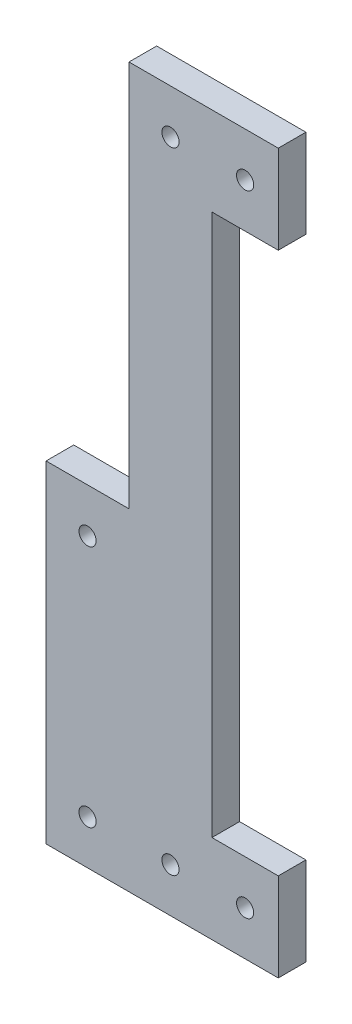
ISO-10303-21;
HEADER;
FILE_DESCRIPTION(('STEP AP214'),'2;1');
FILE_NAME('part.step','',(''),(''),'','','');
FILE_SCHEMA(('AUTOMOTIVE_DESIGN { 1 0 10303 214 1 1 1 1 }'));
ENDSEC;
DATA;
#1=APPLICATION_CONTEXT('core data for automotive mechanical design processes');
#2=APPLICATION_PROTOCOL_DEFINITION('international standard','automotive_design',2000,#1);
#3=PRODUCT_CONTEXT('',#1,'mechanical');
#4=PRODUCT('Part','Part','',(#3));
#5=PRODUCT_RELATED_PRODUCT_CATEGORY('part','',(#4));
#6=PRODUCT_DEFINITION_FORMATION('','',#4);
#7=PRODUCT_DEFINITION_CONTEXT('part definition',#1,'design');
#8=PRODUCT_DEFINITION('design','',#6,#7);
#9=PRODUCT_DEFINITION_SHAPE('','',#8);
#10=(LENGTH_UNIT() NAMED_UNIT(*) SI_UNIT(.MILLI.,.METRE.));
#11=(NAMED_UNIT(*) PLANE_ANGLE_UNIT() SI_UNIT($,.RADIAN.));
#12=(NAMED_UNIT(*) SI_UNIT($,.STERADIAN.) SOLID_ANGLE_UNIT());
#13=UNCERTAINTY_MEASURE_WITH_UNIT(LENGTH_MEASURE(1.E-05),#10,'distance_accuracy_value','');
#14=(GEOMETRIC_REPRESENTATION_CONTEXT(3) GLOBAL_UNCERTAINTY_ASSIGNED_CONTEXT((#13)) GLOBAL_UNIT_ASSIGNED_CONTEXT((#10,
#11,#12)) REPRESENTATION_CONTEXT('',''));
#15=CARTESIAN_POINT('',(0.,0.,0.));
#16=DIRECTION('',(0.,0.,1.));
#17=DIRECTION('',(1.,0.,0.));
#18=AXIS2_PLACEMENT_3D('',#15,#16,#17);
#19=CARTESIAN_POINT('',(0.,0.,5.));
#20=DIRECTION('',(0.,1.,0.));
#21=DIRECTION('',(0.,0.,1.));
#22=AXIS2_PLACEMENT_3D('',#19,#20,#21);
#23=PLANE('',#22);
#24=DIRECTION('',(1.,0.,0.));
#25=VECTOR('',#24,1.);
#26=CARTESIAN_POINT('',(0.,0.,0.));
#27=LINE('',#26,#25);
#28=CARTESIAN_POINT('',(0.,0.,0.));
#29=VERTEX_POINT('',#28);
#30=CARTESIAN_POINT('',(42.,0.,0.));
#31=VERTEX_POINT('',#30);
#32=EDGE_CURVE('E168',#29,#31,#27,.T.);
#33=ORIENTED_EDGE('',*,*,#32,.T.);
#34=DIRECTION('',(0.,0.,-1.));
#35=VECTOR('',#34,1.);
#36=CARTESIAN_POINT('',(42.,0.,5.));
#37=LINE('',#36,#35);
#38=CARTESIAN_POINT('',(42.,0.,5.));
#39=VERTEX_POINT('',#38);
#40=EDGE_CURVE('E11',#39,#31,#37,.T.);
#41=ORIENTED_EDGE('',*,*,#40,.F.);
#42=DIRECTION('',(1.,0.,0.));
#43=VECTOR('',#42,1.);
#44=CARTESIAN_POINT('',(0.,0.,5.));
#45=LINE('',#44,#43);
#46=CARTESIAN_POINT('',(0.,0.,5.));
#47=VERTEX_POINT('',#46);
#48=EDGE_CURVE('E315',#47,#39,#45,.T.);
#49=ORIENTED_EDGE('',*,*,#48,.F.);
#50=DIRECTION('',(0.,0.,-1.));
#51=VECTOR('',#50,1.);
#52=CARTESIAN_POINT('',(0.,0.,5.));
#53=LINE('',#52,#51);
#54=EDGE_CURVE('E56',#47,#29,#53,.T.);
#55=ORIENTED_EDGE('',*,*,#54,.T.);
#56=EDGE_LOOP('',(#33,#41,#49,#55));
#57=FACE_BOUND('',#56,.T.);
#58=ADVANCED_FACE('F39',(#57),#23,.F.);
#59=CARTESIAN_POINT('',(42.,0.,5.));
#60=DIRECTION('',(-1.,0.,0.));
#61=DIRECTION('',(0.,0.,1.));
#62=AXIS2_PLACEMENT_3D('',#59,#60,#61);
#63=PLANE('',#62);
#64=DIRECTION('',(0.,1.,0.));
#65=VECTOR('',#64,1.);
#66=CARTESIAN_POINT('',(42.,0.,0.));
#67=LINE('',#66,#65);
#68=CARTESIAN_POINT('',(42.,16.,0.));
#69=VERTEX_POINT('',#68);
#70=EDGE_CURVE('E170',#31,#69,#67,.T.);
#71=ORIENTED_EDGE('',*,*,#70,.T.);
#72=DIRECTION('',(0.,0.,-1.));
#73=VECTOR('',#72,1.);
#74=CARTESIAN_POINT('',(42.,16.,5.));
#75=LINE('',#74,#73);
#76=CARTESIAN_POINT('',(42.,16.,5.));
#77=VERTEX_POINT('',#76);
#78=EDGE_CURVE('E48',#77,#69,#75,.T.);
#79=ORIENTED_EDGE('',*,*,#78,.F.);
#80=DIRECTION('',(0.,1.,0.));
#81=VECTOR('',#80,1.);
#82=CARTESIAN_POINT('',(42.,0.,5.));
#83=LINE('',#82,#81);
#84=EDGE_CURVE('E100',#39,#77,#83,.T.);
#85=ORIENTED_EDGE('',*,*,#84,.F.);
#86=ORIENTED_EDGE('',*,*,#40,.T.);
#87=EDGE_LOOP('',(#71,#79,#85,#86));
#88=FACE_BOUND('',#87,.T.);
#89=ADVANCED_FACE('F223',(#88),#63,.F.);
#90=CARTESIAN_POINT('',(0.,16.,5.));
#91=DIRECTION('',(0.,1.,0.));
#92=DIRECTION('',(0.,0.,1.));
#93=AXIS2_PLACEMENT_3D('',#90,#91,#92);
#94=PLANE('',#93);
#95=DIRECTION('',(1.,0.,0.));
#96=VECTOR('',#95,1.);
#97=CARTESIAN_POINT('',(0.,16.,0.));
#98=LINE('',#97,#96);
#99=CARTESIAN_POINT('',(30.,16.,0.));
#100=VERTEX_POINT('',#99);
#101=EDGE_CURVE('E173',#100,#69,#98,.T.);
#102=ORIENTED_EDGE('',*,*,#101,.F.);
#103=DIRECTION('',(0.,0.,-1.));
#104=VECTOR('',#103,1.);
#105=CARTESIAN_POINT('',(30.,16.,5.));
#106=LINE('',#105,#104);
#107=CARTESIAN_POINT('',(30.,16.,5.));
#108=VERTEX_POINT('',#107);
#109=EDGE_CURVE('E216',#108,#100,#106,.T.);
#110=ORIENTED_EDGE('',*,*,#109,.F.);
#111=DIRECTION('',(1.,0.,0.));
#112=VECTOR('',#111,1.);
#113=CARTESIAN_POINT('',(0.,16.,5.));
#114=LINE('',#113,#112);
#115=EDGE_CURVE('E222',#108,#77,#114,.T.);
#116=ORIENTED_EDGE('',*,*,#115,.T.);
#117=ORIENTED_EDGE('',*,*,#78,.T.);
#118=EDGE_LOOP('',(#102,#110,#116,#117));
#119=FACE_BOUND('',#118,.T.);
#120=ADVANCED_FACE('F220',(#119),#94,.T.);
#121=CARTESIAN_POINT('',(30.,0.,5.));
#122=DIRECTION('',(-1.,0.,0.));
#123=DIRECTION('',(0.,0.,1.));
#124=AXIS2_PLACEMENT_3D('',#121,#122,#123);
#125=PLANE('',#124);
#126=DIRECTION('',(0.,1.,0.));
#127=VECTOR('',#126,1.);
#128=CARTESIAN_POINT('',(30.,0.,0.));
#129=LINE('',#128,#127);
#130=CARTESIAN_POINT('',(30.,114.,0.));
#131=VERTEX_POINT('',#130);
#132=EDGE_CURVE('E176',#100,#131,#129,.T.);
#133=ORIENTED_EDGE('',*,*,#132,.T.);
#134=DIRECTION('',(0.,0.,-1.));
#135=VECTOR('',#134,1.);
#136=CARTESIAN_POINT('',(30.,114.,5.));
#137=LINE('',#136,#135);
#138=CARTESIAN_POINT('',(30.,114.,5.));
#139=VERTEX_POINT('',#138);
#140=EDGE_CURVE('E213',#139,#131,#137,.T.);
#141=ORIENTED_EDGE('',*,*,#140,.F.);
#142=DIRECTION('',(0.,1.,0.));
#143=VECTOR('',#142,1.);
#144=CARTESIAN_POINT('',(30.,0.,5.));
#145=LINE('',#144,#143);
#146=EDGE_CURVE('E241',#108,#139,#145,.T.);
#147=ORIENTED_EDGE('',*,*,#146,.F.);
#148=ORIENTED_EDGE('',*,*,#109,.T.);
#149=EDGE_LOOP('',(#133,#141,#147,#148));
#150=FACE_BOUND('',#149,.T.);
#151=ADVANCED_FACE('F232',(#150),#125,.F.);
#152=CARTESIAN_POINT('',(0.,114.,5.));
#153=DIRECTION('',(0.,1.,0.));
#154=DIRECTION('',(0.,0.,1.));
#155=AXIS2_PLACEMENT_3D('',#152,#153,#154);
#156=PLANE('',#155);
#157=DIRECTION('',(1.,0.,0.));
#158=VECTOR('',#157,1.);
#159=CARTESIAN_POINT('',(0.,114.,0.));
#160=LINE('',#159,#158);
#161=CARTESIAN_POINT('',(42.,114.,0.));
#162=VERTEX_POINT('',#161);
#163=EDGE_CURVE('E178',#131,#162,#160,.T.);
#164=ORIENTED_EDGE('',*,*,#163,.T.);
#165=DIRECTION('',(0.,0.,-1.));
#166=VECTOR('',#165,1.);
#167=CARTESIAN_POINT('',(42.,114.,5.));
#168=LINE('',#167,#166);
#169=CARTESIAN_POINT('',(42.,114.,5.));
#170=VERTEX_POINT('',#169);
#171=EDGE_CURVE('E211',#170,#162,#168,.T.);
#172=ORIENTED_EDGE('',*,*,#171,.F.);
#173=DIRECTION('',(1.,0.,0.));
#174=VECTOR('',#173,1.);
#175=CARTESIAN_POINT('',(0.,114.,5.));
#176=LINE('',#175,#174);
#177=EDGE_CURVE('E238',#139,#170,#176,.T.);
#178=ORIENTED_EDGE('',*,*,#177,.F.);
#179=ORIENTED_EDGE('',*,*,#140,.T.);
#180=EDGE_LOOP('',(#164,#172,#178,#179));
#181=FACE_BOUND('',#180,.T.);
#182=ADVANCED_FACE('F236',(#181),#156,.F.);
#183=CARTESIAN_POINT('',(42.,0.,5.));
#184=DIRECTION('',(1.,0.,0.));
#185=DIRECTION('',(0.,0.,-1.));
#186=AXIS2_PLACEMENT_3D('',#183,#184,#185);
#187=PLANE('',#186);
#188=DIRECTION('',(0.,-1.,0.));
#189=VECTOR('',#188,1.);
#190=CARTESIAN_POINT('',(42.,0.,0.));
#191=LINE('',#190,#189);
#192=CARTESIAN_POINT('',(42.,130.,0.));
#193=VERTEX_POINT('',#192);
#194=EDGE_CURVE('E181',#193,#162,#191,.T.);
#195=ORIENTED_EDGE('',*,*,#194,.F.);
#196=DIRECTION('',(0.,0.,-1.));
#197=VECTOR('',#196,1.);
#198=CARTESIAN_POINT('',(42.,130.,5.));
#199=LINE('',#198,#197);
#200=CARTESIAN_POINT('',(42.,130.,5.));
#201=VERTEX_POINT('',#200);
#202=EDGE_CURVE('E209',#201,#193,#199,.T.);
#203=ORIENTED_EDGE('',*,*,#202,.F.);
#204=DIRECTION('',(0.,-1.,0.));
#205=VECTOR('',#204,1.);
#206=CARTESIAN_POINT('',(42.,0.,5.));
#207=LINE('',#206,#205);
#208=EDGE_CURVE('E240',#201,#170,#207,.T.);
#209=ORIENTED_EDGE('',*,*,#208,.T.);
#210=ORIENTED_EDGE('',*,*,#171,.T.);
#211=EDGE_LOOP('',(#195,#203,#209,#210));
#212=FACE_BOUND('',#211,.T.);
#213=ADVANCED_FACE('F277',(#212),#187,.T.);
#214=CARTESIAN_POINT('',(0.,130.,5.));
#215=DIRECTION('',(0.,1.,0.));
#216=DIRECTION('',(0.,0.,1.));
#217=AXIS2_PLACEMENT_3D('',#214,#215,#216);
#218=PLANE('',#217);
#219=DIRECTION('',(1.,0.,0.));
#220=VECTOR('',#219,1.);
#221=CARTESIAN_POINT('',(0.,130.,0.));
#222=LINE('',#221,#220);
#223=CARTESIAN_POINT('',(15.,130.,0.));
#224=VERTEX_POINT('',#223);
#225=EDGE_CURVE('E184',#224,#193,#222,.T.);
#226=ORIENTED_EDGE('',*,*,#225,.F.);
#227=DIRECTION('',(0.,0.,-1.));
#228=VECTOR('',#227,1.);
#229=CARTESIAN_POINT('',(15.,130.,5.));
#230=LINE('',#229,#228);
#231=CARTESIAN_POINT('',(15.,130.,5.));
#232=VERTEX_POINT('',#231);
#233=EDGE_CURVE('E131',#232,#224,#230,.T.);
#234=ORIENTED_EDGE('',*,*,#233,.F.);
#235=DIRECTION('',(1.,0.,0.));
#236=VECTOR('',#235,1.);
#237=CARTESIAN_POINT('',(0.,130.,5.));
#238=LINE('',#237,#236);
#239=EDGE_CURVE('E142',#232,#201,#238,.T.);
#240=ORIENTED_EDGE('',*,*,#239,.T.);
#241=ORIENTED_EDGE('',*,*,#202,.T.);
#242=EDGE_LOOP('',(#226,#234,#240,#241));
#243=FACE_BOUND('',#242,.T.);
#244=ADVANCED_FACE('F248',(#243),#218,.T.);
#245=CARTESIAN_POINT('',(15.,0.,5.));
#246=DIRECTION('',(-1.,0.,0.));
#247=DIRECTION('',(0.,0.,1.));
#248=AXIS2_PLACEMENT_3D('',#245,#246,#247);
#249=PLANE('',#248);
#250=DIRECTION('',(0.,1.,0.));
#251=VECTOR('',#250,1.);
#252=CARTESIAN_POINT('',(15.,0.,0.));
#253=LINE('',#252,#251);
#254=CARTESIAN_POINT('',(15.,60.,0.));
#255=VERTEX_POINT('',#254);
#256=EDGE_CURVE('E127',#255,#224,#253,.T.);
#257=ORIENTED_EDGE('',*,*,#256,.F.);
#258=DIRECTION('',(0.,0.,-1.));
#259=VECTOR('',#258,1.);
#260=CARTESIAN_POINT('',(15.,60.,5.));
#261=LINE('',#260,#259);
#262=CARTESIAN_POINT('',(15.,60.,5.));
#263=VERTEX_POINT('',#262);
#264=EDGE_CURVE('E122',#263,#255,#261,.T.);
#265=ORIENTED_EDGE('',*,*,#264,.F.);
#266=DIRECTION('',(0.,1.,0.));
#267=VECTOR('',#266,1.);
#268=CARTESIAN_POINT('',(15.,0.,5.));
#269=LINE('',#268,#267);
#270=EDGE_CURVE('E125',#263,#232,#269,.T.);
#271=ORIENTED_EDGE('',*,*,#270,.T.);
#272=ORIENTED_EDGE('',*,*,#233,.T.);
#273=EDGE_LOOP('',(#257,#265,#271,#272));
#274=FACE_BOUND('',#273,.T.);
#275=ADVANCED_FACE('F124',(#274),#249,.T.);
#276=CARTESIAN_POINT('',(0.,60.,5.));
#277=DIRECTION('',(0.,1.,0.));
#278=DIRECTION('',(0.,0.,1.));
#279=AXIS2_PLACEMENT_3D('',#276,#277,#278);
#280=PLANE('',#279);
#281=DIRECTION('',(1.,0.,0.));
#282=VECTOR('',#281,1.);
#283=CARTESIAN_POINT('',(0.,60.,0.));
#284=LINE('',#283,#282);
#285=CARTESIAN_POINT('',(0.,60.,0.));
#286=VERTEX_POINT('',#285);
#287=EDGE_CURVE('E188',#286,#255,#284,.T.);
#288=ORIENTED_EDGE('',*,*,#287,.F.);
#289=DIRECTION('',(0.,0.,-1.));
#290=VECTOR('',#289,1.);
#291=CARTESIAN_POINT('',(0.,60.,5.));
#292=LINE('',#291,#290);
#293=CARTESIAN_POINT('',(0.,60.,5.));
#294=VERTEX_POINT('',#293);
#295=EDGE_CURVE('E88',#294,#286,#292,.T.);
#296=ORIENTED_EDGE('',*,*,#295,.F.);
#297=DIRECTION('',(1.,0.,0.));
#298=VECTOR('',#297,1.);
#299=CARTESIAN_POINT('',(0.,60.,5.));
#300=LINE('',#299,#298);
#301=EDGE_CURVE('E139',#294,#263,#300,.T.);
#302=ORIENTED_EDGE('',*,*,#301,.T.);
#303=ORIENTED_EDGE('',*,*,#264,.T.);
#304=EDGE_LOOP('',(#288,#296,#302,#303));
#305=FACE_BOUND('',#304,.T.);
#306=ADVANCED_FACE('F144',(#305),#280,.T.);
#307=CARTESIAN_POINT('',(36.,122.,5.));
#308=DIRECTION('',(0.,0.,-1.));
#309=DIRECTION('',(-1.,0.,0.));
#310=AXIS2_PLACEMENT_3D('',#307,#308,#309);
#311=CYLINDRICAL_SURFACE('',#310,1.55);
#312=CARTESIAN_POINT('',(36.,122.,5.));
#313=DIRECTION('',(0.,0.,1.));
#314=DIRECTION('',(1.,0.,0.));
#315=AXIS2_PLACEMENT_3D('',#312,#313,#314);
#316=CIRCLE('',#315,1.55);
#317=CARTESIAN_POINT('',(37.55,122.,5.));
#318=VERTEX_POINT('',#317);
#319=EDGE_CURVE('E156',#318,#318,#316,.T.);
#320=ORIENTED_EDGE('',*,*,#319,.T.);
#321=EDGE_LOOP('',(#320));
#322=FACE_BOUND('',#321,.T.);
#323=CARTESIAN_POINT('',(36.,122.,0.));
#324=DIRECTION('',(0.,0.,1.));
#325=DIRECTION('',(1.,0.,0.));
#326=AXIS2_PLACEMENT_3D('',#323,#324,#325);
#327=CIRCLE('',#326,1.55);
#328=CARTESIAN_POINT('',(37.55,122.,0.));
#329=VERTEX_POINT('',#328);
#330=EDGE_CURVE('E199',#329,#329,#327,.T.);
#331=ORIENTED_EDGE('',*,*,#330,.F.);
#332=EDGE_LOOP('',(#331));
#333=FACE_BOUND('',#332,.T.);
#334=ADVANCED_FACE('F285',(#322,#333),#311,.F.);
#335=CARTESIAN_POINT('',(22.5,122.,5.));
#336=DIRECTION('',(0.,0.,-1.));
#337=DIRECTION('',(-1.,0.,0.));
#338=AXIS2_PLACEMENT_3D('',#335,#336,#337);
#339=CYLINDRICAL_SURFACE('',#338,1.55);
#340=CARTESIAN_POINT('',(22.5,122.,5.));
#341=DIRECTION('',(0.,0.,1.));
#342=DIRECTION('',(1.,0.,0.));
#343=AXIS2_PLACEMENT_3D('',#340,#341,#342);
#344=CIRCLE('',#343,1.55);
#345=CARTESIAN_POINT('',(24.05,122.,5.));
#346=VERTEX_POINT('',#345);
#347=EDGE_CURVE('E153',#346,#346,#344,.T.);
#348=ORIENTED_EDGE('',*,*,#347,.T.);
#349=EDGE_LOOP('',(#348));
#350=FACE_BOUND('',#349,.T.);
#351=CARTESIAN_POINT('',(22.5,122.,0.));
#352=DIRECTION('',(0.,0.,1.));
#353=DIRECTION('',(1.,0.,0.));
#354=AXIS2_PLACEMENT_3D('',#351,#352,#353);
#355=CIRCLE('',#354,1.55);
#356=CARTESIAN_POINT('',(24.05,122.,0.));
#357=VERTEX_POINT('',#356);
#358=EDGE_CURVE('E196',#357,#357,#355,.T.);
#359=ORIENTED_EDGE('',*,*,#358,.F.);
#360=EDGE_LOOP('',(#359));
#361=FACE_BOUND('',#360,.T.);
#362=ADVANCED_FACE('F260',(#350,#361),#339,.F.);
#363=CARTESIAN_POINT('',(22.5,8.,5.));
#364=DIRECTION('',(0.,0.,-1.));
#365=DIRECTION('',(-1.,0.,0.));
#366=AXIS2_PLACEMENT_3D('',#363,#364,#365);
#367=CYLINDRICAL_SURFACE('',#366,1.55);
#368=CARTESIAN_POINT('',(22.5,8.,5.));
#369=DIRECTION('',(0.,0.,1.));
#370=DIRECTION('',(1.,0.,0.));
#371=AXIS2_PLACEMENT_3D('',#368,#369,#370);
#372=CIRCLE('',#371,1.55);
#373=CARTESIAN_POINT('',(24.05,8.,5.));
#374=VERTEX_POINT('',#373);
#375=EDGE_CURVE('E147',#374,#374,#372,.T.);
#376=ORIENTED_EDGE('',*,*,#375,.T.);
#377=EDGE_LOOP('',(#376));
#378=FACE_BOUND('',#377,.T.);
#379=CARTESIAN_POINT('',(22.5,8.,0.));
#380=DIRECTION('',(0.,0.,1.));
#381=DIRECTION('',(1.,0.,0.));
#382=AXIS2_PLACEMENT_3D('',#379,#380,#381);
#383=CIRCLE('',#382,1.55);
#384=CARTESIAN_POINT('',(24.05,8.,0.));
#385=VERTEX_POINT('',#384);
#386=EDGE_CURVE('E193',#385,#385,#383,.T.);
#387=ORIENTED_EDGE('',*,*,#386,.F.);
#388=EDGE_LOOP('',(#387));
#389=FACE_BOUND('',#388,.T.);
#390=ADVANCED_FACE('F253',(#378,#389),#367,.F.);
#391=CARTESIAN_POINT('',(0.,0.,5.));
#392=DIRECTION('',(-1.,0.,0.));
#393=DIRECTION('',(0.,0.,1.));
#394=AXIS2_PLACEMENT_3D('',#391,#392,#393);
#395=PLANE('',#394);
#396=DIRECTION('',(0.,1.,0.));
#397=VECTOR('',#396,1.);
#398=CARTESIAN_POINT('',(0.,0.,0.));
#399=LINE('',#398,#397);
#400=EDGE_CURVE('E190',#29,#286,#399,.T.);
#401=ORIENTED_EDGE('',*,*,#400,.F.);
#402=ORIENTED_EDGE('',*,*,#54,.F.);
#403=DIRECTION('',(0.,1.,0.));
#404=VECTOR('',#403,1.);
#405=CARTESIAN_POINT('',(0.,0.,5.));
#406=LINE('',#405,#404);
#407=EDGE_CURVE('E145',#47,#294,#406,.T.);
#408=ORIENTED_EDGE('',*,*,#407,.T.);
#409=ORIENTED_EDGE('',*,*,#295,.T.);
#410=EDGE_LOOP('',(#401,#402,#408,#409));
#411=FACE_BOUND('',#410,.T.);
#412=ADVANCED_FACE('F250',(#411),#395,.T.);
#413=CARTESIAN_POINT('',(7.5,52.,5.));
#414=DIRECTION('',(0.,0.,-1.));
#415=DIRECTION('',(-1.,0.,0.));
#416=AXIS2_PLACEMENT_3D('',#413,#414,#415);
#417=CYLINDRICAL_SURFACE('',#416,1.55);
#418=CARTESIAN_POINT('',(7.5,52.,5.));
#419=DIRECTION('',(0.,0.,1.));
#420=DIRECTION('',(1.,0.,0.));
#421=AXIS2_PLACEMENT_3D('',#418,#419,#420);
#422=CIRCLE('',#421,1.55);
#423=CARTESIAN_POINT('',(9.05,52.,5.));
#424=VERTEX_POINT('',#423);
#425=EDGE_CURVE('E314',#424,#424,#422,.T.);
#426=ORIENTED_EDGE('',*,*,#425,.T.);
#427=EDGE_LOOP('',(#426));
#428=FACE_BOUND('',#427,.T.);
#429=CARTESIAN_POINT('',(7.5,52.,0.));
#430=DIRECTION('',(0.,0.,1.));
#431=DIRECTION('',(1.,0.,0.));
#432=AXIS2_PLACEMENT_3D('',#429,#430,#431);
#433=CIRCLE('',#432,1.55);
#434=CARTESIAN_POINT('',(9.05,52.,0.));
#435=VERTEX_POINT('',#434);
#436=EDGE_CURVE('E165',#435,#435,#433,.T.);
#437=ORIENTED_EDGE('',*,*,#436,.F.);
#438=EDGE_LOOP('',(#437));
#439=FACE_BOUND('',#438,.T.);
#440=ADVANCED_FACE('F252',(#428,#439),#417,.F.);
#441=CARTESIAN_POINT('',(7.5,8.,5.));
#442=DIRECTION('',(0.,0.,-1.));
#443=DIRECTION('',(-1.,0.,0.));
#444=AXIS2_PLACEMENT_3D('',#441,#442,#443);
#445=CYLINDRICAL_SURFACE('',#444,1.55);
#446=CARTESIAN_POINT('',(7.5,8.,5.));
#447=DIRECTION('',(0.,0.,1.));
#448=DIRECTION('',(1.,0.,0.));
#449=AXIS2_PLACEMENT_3D('',#446,#447,#448);
#450=CIRCLE('',#449,1.55);
#451=CARTESIAN_POINT('',(9.05,8.,5.));
#452=VERTEX_POINT('',#451);
#453=EDGE_CURVE('E205',#452,#452,#450,.T.);
#454=ORIENTED_EDGE('',*,*,#453,.T.);
#455=EDGE_LOOP('',(#454));
#456=FACE_BOUND('',#455,.T.);
#457=CARTESIAN_POINT('',(7.5,8.,0.));
#458=DIRECTION('',(0.,0.,1.));
#459=DIRECTION('',(1.,0.,0.));
#460=AXIS2_PLACEMENT_3D('',#457,#458,#459);
#461=CIRCLE('',#460,1.55);
#462=CARTESIAN_POINT('',(9.05,8.,0.));
#463=VERTEX_POINT('',#462);
#464=EDGE_CURVE('E162',#463,#463,#461,.T.);
#465=ORIENTED_EDGE('',*,*,#464,.F.);
#466=EDGE_LOOP('',(#465));
#467=FACE_BOUND('',#466,.T.);
#468=ADVANCED_FACE('F41',(#456,#467),#445,.F.);
#469=CARTESIAN_POINT('',(36.,8.,5.));
#470=DIRECTION('',(0.,0.,-1.));
#471=DIRECTION('',(-1.,0.,0.));
#472=AXIS2_PLACEMENT_3D('',#469,#470,#471);
#473=CYLINDRICAL_SURFACE('',#472,1.55);
#474=CARTESIAN_POINT('',(36.,8.,5.));
#475=DIRECTION('',(0.,0.,1.));
#476=DIRECTION('',(1.,0.,0.));
#477=AXIS2_PLACEMENT_3D('',#474,#475,#476);
#478=CIRCLE('',#477,1.55);
#479=CARTESIAN_POINT('',(37.55,8.,5.));
#480=VERTEX_POINT('',#479);
#481=EDGE_CURVE('E159',#480,#480,#478,.T.);
#482=ORIENTED_EDGE('',*,*,#481,.T.);
#483=EDGE_LOOP('',(#482));
#484=FACE_BOUND('',#483,.T.);
#485=CARTESIAN_POINT('',(36.,8.,0.));
#486=DIRECTION('',(0.,0.,1.));
#487=DIRECTION('',(1.,0.,0.));
#488=AXIS2_PLACEMENT_3D('',#485,#486,#487);
#489=CIRCLE('',#488,1.55);
#490=CARTESIAN_POINT('',(37.55,8.,0.));
#491=VERTEX_POINT('',#490);
#492=EDGE_CURVE('E202',#491,#491,#489,.T.);
#493=ORIENTED_EDGE('',*,*,#492,.F.);
#494=EDGE_LOOP('',(#493));
#495=FACE_BOUND('',#494,.T.);
#496=ADVANCED_FACE('F298',(#484,#495),#473,.F.);
#497=CARTESIAN_POINT('',(0.,0.,5.));
#498=DIRECTION('',(0.,0.,1.));
#499=DIRECTION('',(1.,0.,0.));
#500=AXIS2_PLACEMENT_3D('',#497,#498,#499);
#501=PLANE('',#500);
#502=ORIENTED_EDGE('',*,*,#453,.F.);
#503=EDGE_LOOP('',(#502));
#504=FACE_BOUND('',#503,.T.);
#505=ORIENTED_EDGE('',*,*,#425,.F.);
#506=EDGE_LOOP('',(#505));
#507=FACE_BOUND('',#506,.T.);
#508=ORIENTED_EDGE('',*,*,#48,.T.);
#509=ORIENTED_EDGE('',*,*,#84,.T.);
#510=ORIENTED_EDGE('',*,*,#115,.F.);
#511=ORIENTED_EDGE('',*,*,#146,.T.);
#512=ORIENTED_EDGE('',*,*,#177,.T.);
#513=ORIENTED_EDGE('',*,*,#208,.F.);
#514=ORIENTED_EDGE('',*,*,#239,.F.);
#515=ORIENTED_EDGE('',*,*,#270,.F.);
#516=ORIENTED_EDGE('',*,*,#301,.F.);
#517=ORIENTED_EDGE('',*,*,#407,.F.);
#518=EDGE_LOOP('',(#508,#509,#510,#511,#512,#513,#514,#515,#516,#517));
#519=FACE_BOUND('',#518,.T.);
#520=ORIENTED_EDGE('',*,*,#375,.F.);
#521=EDGE_LOOP('',(#520));
#522=FACE_BOUND('',#521,.T.);
#523=ORIENTED_EDGE('',*,*,#347,.F.);
#524=EDGE_LOOP('',(#523));
#525=FACE_BOUND('',#524,.T.);
#526=ORIENTED_EDGE('',*,*,#319,.F.);
#527=EDGE_LOOP('',(#526));
#528=FACE_BOUND('',#527,.T.);
#529=ORIENTED_EDGE('',*,*,#481,.F.);
#530=EDGE_LOOP('',(#529));
#531=FACE_BOUND('',#530,.T.);
#532=ADVANCED_FACE('F136',(#504,#507,#519,#522,#525,#528,#531),#501,.T.);
#533=CARTESIAN_POINT('',(0.,0.,0.));
#534=DIRECTION('',(0.,0.,1.));
#535=DIRECTION('',(1.,0.,0.));
#536=AXIS2_PLACEMENT_3D('',#533,#534,#535);
#537=PLANE('',#536);
#538=ORIENTED_EDGE('',*,*,#464,.T.);
#539=EDGE_LOOP('',(#538));
#540=FACE_BOUND('',#539,.T.);
#541=ORIENTED_EDGE('',*,*,#436,.T.);
#542=EDGE_LOOP('',(#541));
#543=FACE_BOUND('',#542,.T.);
#544=ORIENTED_EDGE('',*,*,#32,.F.);
#545=ORIENTED_EDGE('',*,*,#400,.T.);
#546=ORIENTED_EDGE('',*,*,#287,.T.);
#547=ORIENTED_EDGE('',*,*,#256,.T.);
#548=ORIENTED_EDGE('',*,*,#225,.T.);
#549=ORIENTED_EDGE('',*,*,#194,.T.);
#550=ORIENTED_EDGE('',*,*,#163,.F.);
#551=ORIENTED_EDGE('',*,*,#132,.F.);
#552=ORIENTED_EDGE('',*,*,#101,.T.);
#553=ORIENTED_EDGE('',*,*,#70,.F.);
#554=EDGE_LOOP('',(#544,#545,#546,#547,#548,#549,#550,#551,#552,#553));
#555=FACE_BOUND('',#554,.T.);
#556=ORIENTED_EDGE('',*,*,#386,.T.);
#557=EDGE_LOOP('',(#556));
#558=FACE_BOUND('',#557,.T.);
#559=ORIENTED_EDGE('',*,*,#358,.T.);
#560=EDGE_LOOP('',(#559));
#561=FACE_BOUND('',#560,.T.);
#562=ORIENTED_EDGE('',*,*,#330,.T.);
#563=EDGE_LOOP('',(#562));
#564=FACE_BOUND('',#563,.T.);
#565=ORIENTED_EDGE('',*,*,#492,.T.);
#566=EDGE_LOOP('',(#565));
#567=FACE_BOUND('',#566,.T.);
#568=ADVANCED_FACE('F227',(#540,#543,#555,#558,#561,#564,#567),#537,.F.);
#569=CLOSED_SHELL('',(#58,#89,#120,#151,#182,#213,#244,#275,#306,#334,#362,#390,#412,#440,#468,
#496,#532,#568));
#570=MANIFOLD_SOLID_BREP('B2',#569);
#571=ADVANCED_BREP_SHAPE_REPRESENTATION('',(#18,#570),#14);
#572=SHAPE_DEFINITION_REPRESENTATION(#9,#571);
ENDSEC;
END-ISO-10303-21;
